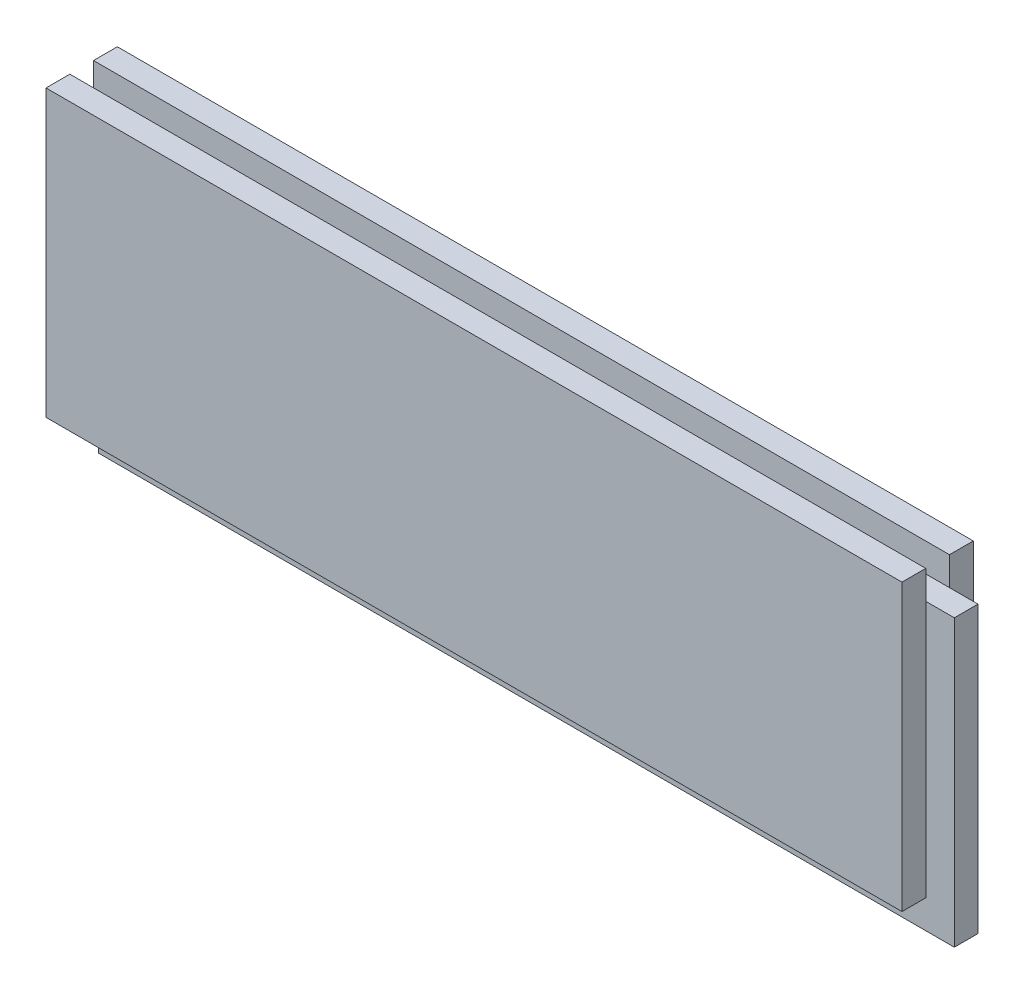
ISO-10303-21;
HEADER;
FILE_DESCRIPTION(('STEP AP214'),'2;1');
FILE_NAME('part.step','',(''),(''),'','','');
FILE_SCHEMA(('AUTOMOTIVE_DESIGN { 1 0 10303 214 1 1 1 1 }'));
ENDSEC;
DATA;
#1=APPLICATION_CONTEXT('core data for automotive mechanical design processes');
#2=APPLICATION_PROTOCOL_DEFINITION('international standard','automotive_design',2000,#1);
#3=PRODUCT_CONTEXT('',#1,'mechanical');
#4=PRODUCT('Part','Part','',(#3));
#5=PRODUCT_RELATED_PRODUCT_CATEGORY('part','',(#4));
#6=PRODUCT_DEFINITION_FORMATION('','',#4);
#7=PRODUCT_DEFINITION_CONTEXT('part definition',#1,'design');
#8=PRODUCT_DEFINITION('design','',#6,#7);
#9=PRODUCT_DEFINITION_SHAPE('','',#8);
#10=(LENGTH_UNIT() NAMED_UNIT(*) SI_UNIT(.MILLI.,.METRE.));
#11=(NAMED_UNIT(*) PLANE_ANGLE_UNIT() SI_UNIT($,.RADIAN.));
#12=(NAMED_UNIT(*) SI_UNIT($,.STERADIAN.) SOLID_ANGLE_UNIT());
#13=UNCERTAINTY_MEASURE_WITH_UNIT(LENGTH_MEASURE(1.E-05),#10,'distance_accuracy_value','');
#14=(GEOMETRIC_REPRESENTATION_CONTEXT(3) GLOBAL_UNCERTAINTY_ASSIGNED_CONTEXT((#13)) GLOBAL_UNIT_ASSIGNED_CONTEXT((#10,
#11,#12)) REPRESENTATION_CONTEXT('',''));
#15=CARTESIAN_POINT('',(0.,0.,0.));
#16=DIRECTION('',(0.,0.,1.));
#17=DIRECTION('',(1.,0.,0.));
#18=AXIS2_PLACEMENT_3D('',#15,#16,#17);
#19=CARTESIAN_POINT('',(30.,-10.,2.5));
#20=DIRECTION('',(-1.,0.,0.));
#21=DIRECTION('',(0.,0.,1.));
#22=AXIS2_PLACEMENT_3D('',#19,#20,#21);
#23=PLANE('',#22);
#24=DIRECTION('',(0.,-1.,0.));
#25=VECTOR('',#24,1.);
#26=CARTESIAN_POINT('',(30.,-12.,0.830000000000011));
#27=LINE('',#26,#25);
#28=CARTESIAN_POINT('',(30.,8.,0.830000000000002));
#29=VERTEX_POINT('',#28);
#30=CARTESIAN_POINT('',(30.,-10.,0.830000000000011));
#31=VERTEX_POINT('',#30);
#32=EDGE_CURVE('E161',#29,#31,#27,.T.);
#33=ORIENTED_EDGE('',*,*,#32,.F.);
#34=DIRECTION('',(0.,1.,0.));
#35=VECTOR('',#34,1.);
#36=CARTESIAN_POINT('',(30.,8.,0.830000000000002));
#37=LINE('',#36,#35);
#38=CARTESIAN_POINT('',(30.,10.,0.830000000000002));
#39=VERTEX_POINT('',#38);
#40=EDGE_CURVE('E225',#29,#39,#37,.T.);
#41=ORIENTED_EDGE('',*,*,#40,.T.);
#42=DIRECTION('',(0.,0.,-1.));
#43=VECTOR('',#42,1.);
#44=CARTESIAN_POINT('',(30.,10.,2.5));
#45=LINE('',#44,#43);
#46=CARTESIAN_POINT('',(30.,10.,2.5));
#47=VERTEX_POINT('',#46);
#48=EDGE_CURVE('E254',#47,#39,#45,.T.);
#49=ORIENTED_EDGE('',*,*,#48,.F.);
#50=DIRECTION('',(0.,1.,0.));
#51=VECTOR('',#50,1.);
#52=CARTESIAN_POINT('',(30.,-10.,2.5));
#53=LINE('',#52,#51);
#54=CARTESIAN_POINT('',(30.,-10.,2.5));
#55=VERTEX_POINT('',#54);
#56=EDGE_CURVE('E235',#55,#47,#53,.T.);
#57=ORIENTED_EDGE('',*,*,#56,.F.);
#58=DIRECTION('',(0.,0.,-1.));
#59=VECTOR('',#58,1.);
#60=CARTESIAN_POINT('',(30.,-10.,2.5));
#61=LINE('',#60,#59);
#62=EDGE_CURVE('E259',#55,#31,#61,.T.);
#63=ORIENTED_EDGE('',*,*,#62,.T.);
#64=EDGE_LOOP('',(#33,#41,#49,#57,#63));
#65=FACE_BOUND('',#64,.T.);
#66=ADVANCED_FACE('F33',(#65),#23,.F.);
#67=DIRECTION('',(0.,1.,0.));
#68=VECTOR('',#67,1.);
#69=CARTESIAN_POINT('',(30.,-12.,-0.83000000000002));
#70=LINE('',#69,#68);
#71=CARTESIAN_POINT('',(30.,-10.,-0.829999999999991));
#72=VERTEX_POINT('',#71);
#73=CARTESIAN_POINT('',(30.,8.,-0.83000000000002));
#74=VERTEX_POINT('',#73);
#75=EDGE_CURVE('E11',#72,#74,#70,.T.);
#76=ORIENTED_EDGE('',*,*,#75,.F.);
#77=CARTESIAN_POINT('',(30.,-10.,-2.5));
#78=VERTEX_POINT('',#77);
#79=EDGE_CURVE('E186',#72,#78,#61,.T.);
#80=ORIENTED_EDGE('',*,*,#79,.T.);
#81=DIRECTION('',(0.,1.,0.));
#82=VECTOR('',#81,1.);
#83=CARTESIAN_POINT('',(30.,-10.,-2.5));
#84=LINE('',#83,#82);
#85=CARTESIAN_POINT('',(30.,10.,-2.5));
#86=VERTEX_POINT('',#85);
#87=EDGE_CURVE('E245',#78,#86,#84,.T.);
#88=ORIENTED_EDGE('',*,*,#87,.T.);
#89=CARTESIAN_POINT('',(30.,10.,-0.83000000000002));
#90=VERTEX_POINT('',#89);
#91=EDGE_CURVE('E253',#90,#86,#45,.T.);
#92=ORIENTED_EDGE('',*,*,#91,.F.);
#93=DIRECTION('',(0.,1.,0.));
#94=VECTOR('',#93,1.);
#95=CARTESIAN_POINT('',(30.,8.,-0.83000000000002));
#96=LINE('',#95,#94);
#97=EDGE_CURVE('E223',#74,#90,#96,.T.);
#98=ORIENTED_EDGE('',*,*,#97,.F.);
#99=EDGE_LOOP('',(#76,#80,#88,#92,#98));
#100=FACE_BOUND('',#99,.T.);
#101=ADVANCED_FACE('F265',(#100),#23,.F.);
#102=CARTESIAN_POINT('',(30.,-10.,2.5));
#103=DIRECTION('',(0.,1.,0.));
#104=DIRECTION('',(-1.,0.,0.));
#105=AXIS2_PLACEMENT_3D('',#102,#103,#104);
#106=PLANE('',#105);
#107=DIRECTION('',(-1.,0.,0.));
#108=VECTOR('',#107,1.);
#109=CARTESIAN_POINT('',(-28.,-10.,0.830000000000011));
#110=LINE('',#109,#108);
#111=CARTESIAN_POINT('',(-28.,-10.,0.830000000000011));
#112=VERTEX_POINT('',#111);
#113=EDGE_CURVE('E49',#31,#112,#110,.T.);
#114=ORIENTED_EDGE('',*,*,#113,.F.);
#115=ORIENTED_EDGE('',*,*,#62,.F.);
#116=DIRECTION('',(1.,0.,0.));
#117=VECTOR('',#116,1.);
#118=CARTESIAN_POINT('',(30.,-10.,2.5));
#119=LINE('',#118,#117);
#120=CARTESIAN_POINT('',(-30.,-10.,2.5));
#121=VERTEX_POINT('',#120);
#122=EDGE_CURVE('E232',#121,#55,#119,.T.);
#123=ORIENTED_EDGE('',*,*,#122,.F.);
#124=DIRECTION('',(0.,0.,-1.));
#125=VECTOR('',#124,1.);
#126=CARTESIAN_POINT('',(-30.,-10.,2.5));
#127=LINE('',#126,#125);
#128=CARTESIAN_POINT('',(-30.,-10.,0.830000000000011));
#129=VERTEX_POINT('',#128);
#130=EDGE_CURVE('E42',#121,#129,#127,.T.);
#131=ORIENTED_EDGE('',*,*,#130,.T.);
#132=DIRECTION('',(-1.,0.,0.));
#133=VECTOR('',#132,1.);
#134=CARTESIAN_POINT('',(-28.,-10.,0.830000000000011));
#135=LINE('',#134,#133);
#136=EDGE_CURVE('E203',#112,#129,#135,.T.);
#137=ORIENTED_EDGE('',*,*,#136,.F.);
#138=EDGE_LOOP('',(#114,#115,#123,#131,#137));
#139=FACE_BOUND('',#138,.T.);
#140=ADVANCED_FACE('F304',(#139),#106,.F.);
#141=DIRECTION('',(1.,0.,0.));
#142=VECTOR('',#141,1.);
#143=CARTESIAN_POINT('',(-28.,-10.,-0.829999999999991));
#144=LINE('',#143,#142);
#145=CARTESIAN_POINT('',(-28.,-10.,-0.829999999999991));
#146=VERTEX_POINT('',#145);
#147=EDGE_CURVE('E182',#146,#72,#144,.T.);
#148=ORIENTED_EDGE('',*,*,#147,.F.);
#149=DIRECTION('',(-1.,0.,0.));
#150=VECTOR('',#149,1.);
#151=CARTESIAN_POINT('',(-28.,-10.,-0.829999999999991));
#152=LINE('',#151,#150);
#153=CARTESIAN_POINT('',(-30.,-10.,-0.829999999999991));
#154=VERTEX_POINT('',#153);
#155=EDGE_CURVE('E202',#146,#154,#152,.T.);
#156=ORIENTED_EDGE('',*,*,#155,.T.);
#157=CARTESIAN_POINT('',(-30.,-10.,-2.5));
#158=VERTEX_POINT('',#157);
#159=EDGE_CURVE('E260',#154,#158,#127,.T.);
#160=ORIENTED_EDGE('',*,*,#159,.T.);
#161=DIRECTION('',(1.,0.,0.));
#162=VECTOR('',#161,1.);
#163=CARTESIAN_POINT('',(30.,-10.,-2.5));
#164=LINE('',#163,#162);
#165=EDGE_CURVE('E242',#158,#78,#164,.T.);
#166=ORIENTED_EDGE('',*,*,#165,.T.);
#167=ORIENTED_EDGE('',*,*,#79,.F.);
#168=EDGE_LOOP('',(#148,#156,#160,#166,#167));
#169=FACE_BOUND('',#168,.T.);
#170=ADVANCED_FACE('F271',(#169),#106,.F.);
#171=CARTESIAN_POINT('',(-30.,-10.,2.5));
#172=DIRECTION('',(1.,0.,0.));
#173=DIRECTION('',(0.,0.,-1.));
#174=AXIS2_PLACEMENT_3D('',#171,#172,#173);
#175=PLANE('',#174);
#176=ORIENTED_EDGE('',*,*,#159,.F.);
#177=DIRECTION('',(0.,1.,0.));
#178=VECTOR('',#177,1.);
#179=CARTESIAN_POINT('',(-30.,8.,-0.829999999999991));
#180=LINE('',#179,#178);
#181=CARTESIAN_POINT('',(-30.,10.,-0.829999999999991));
#182=VERTEX_POINT('',#181);
#183=EDGE_CURVE('E219',#154,#182,#180,.T.);
#184=ORIENTED_EDGE('',*,*,#183,.T.);
#185=DIRECTION('',(0.,0.,-1.));
#186=VECTOR('',#185,1.);
#187=CARTESIAN_POINT('',(-30.,10.,2.5));
#188=LINE('',#187,#186);
#189=CARTESIAN_POINT('',(-30.,10.,-2.5));
#190=VERTEX_POINT('',#189);
#191=EDGE_CURVE('E239',#182,#190,#188,.T.);
#192=ORIENTED_EDGE('',*,*,#191,.T.);
#193=DIRECTION('',(0.,-1.,0.));
#194=VECTOR('',#193,1.);
#195=CARTESIAN_POINT('',(-30.,-10.,-2.5));
#196=LINE('',#195,#194);
#197=EDGE_CURVE('E222',#190,#158,#196,.T.);
#198=ORIENTED_EDGE('',*,*,#197,.T.);
#199=EDGE_LOOP('',(#176,#184,#192,#198));
#200=FACE_BOUND('',#199,.T.);
#201=ADVANCED_FACE('F310',(#200),#175,.F.);
#202=CARTESIAN_POINT('',(0.,8.,0.));
#203=DIRECTION('',(0.,1.,0.));
#204=DIRECTION('',(-1.,0.,0.));
#205=AXIS2_PLACEMENT_3D('',#202,#203,#204);
#206=PLANE('',#205);
#207=DIRECTION('',(-1.,0.,0.));
#208=VECTOR('',#207,1.);
#209=CARTESIAN_POINT('',(-30.,8.,-0.829999999999991));
#210=LINE('',#209,#208);
#211=CARTESIAN_POINT('',(-28.,8.,-0.829999999999991));
#212=VERTEX_POINT('',#211);
#213=EDGE_CURVE('E212',#74,#212,#210,.T.);
#214=ORIENTED_EDGE('',*,*,#213,.T.);
#215=DIRECTION('',(0.,0.,-1.));
#216=VECTOR('',#215,1.);
#217=CARTESIAN_POINT('',(-28.,8.,-0.829999999999991));
#218=LINE('',#217,#216);
#219=CARTESIAN_POINT('',(-28.,8.,0.830000000000009));
#220=VERTEX_POINT('',#219);
#221=EDGE_CURVE('E200',#220,#212,#218,.T.);
#222=ORIENTED_EDGE('',*,*,#221,.F.);
#223=DIRECTION('',(1.,0.,0.));
#224=VECTOR('',#223,1.);
#225=CARTESIAN_POINT('',(-30.,8.,0.830000000000009));
#226=LINE('',#225,#224);
#227=EDGE_CURVE('E209',#220,#29,#226,.T.);
#228=ORIENTED_EDGE('',*,*,#227,.T.);
#229=DIRECTION('',(-1.,0.,0.));
#230=VECTOR('',#229,1.);
#231=CARTESIAN_POINT('',(32.,8.,0.830000000000011));
#232=LINE('',#231,#230);
#233=CARTESIAN_POINT('',(32.,8.,0.830000000000011));
#234=VERTEX_POINT('',#233);
#235=EDGE_CURVE('E168',#234,#29,#232,.T.);
#236=ORIENTED_EDGE('',*,*,#235,.F.);
#237=DIRECTION('',(0.,0.,1.));
#238=VECTOR('',#237,1.);
#239=CARTESIAN_POINT('',(32.,8.,0.830000000000011));
#240=LINE('',#239,#238);
#241=CARTESIAN_POINT('',(32.,8.,-0.83000000000002));
#242=VERTEX_POINT('',#241);
#243=EDGE_CURVE('E159',#242,#234,#240,.T.);
#244=ORIENTED_EDGE('',*,*,#243,.F.);
#245=DIRECTION('',(-1.,0.,0.));
#246=VECTOR('',#245,1.);
#247=CARTESIAN_POINT('',(32.,8.,-0.83000000000002));
#248=LINE('',#247,#246);
#249=EDGE_CURVE('E174',#242,#74,#248,.T.);
#250=ORIENTED_EDGE('',*,*,#249,.T.);
#251=EDGE_LOOP('',(#214,#222,#228,#236,#244,#250));
#252=FACE_BOUND('',#251,.T.);
#253=ADVANCED_FACE('F288',(#252),#206,.T.);
#254=CARTESIAN_POINT('',(30.,10.,2.5));
#255=DIRECTION('',(0.,-1.,0.));
#256=DIRECTION('',(1.,0.,0.));
#257=AXIS2_PLACEMENT_3D('',#254,#255,#256);
#258=PLANE('',#257);
#259=ORIENTED_EDGE('',*,*,#191,.F.);
#260=DIRECTION('',(-1.,0.,0.));
#261=VECTOR('',#260,1.);
#262=CARTESIAN_POINT('',(-30.,10.,-0.829999999999991));
#263=LINE('',#262,#261);
#264=EDGE_CURVE('E213',#90,#182,#263,.T.);
#265=ORIENTED_EDGE('',*,*,#264,.F.);
#266=ORIENTED_EDGE('',*,*,#91,.T.);
#267=DIRECTION('',(-1.,0.,0.));
#268=VECTOR('',#267,1.);
#269=CARTESIAN_POINT('',(30.,10.,-2.5));
#270=LINE('',#269,#268);
#271=EDGE_CURVE('E233',#86,#190,#270,.T.);
#272=ORIENTED_EDGE('',*,*,#271,.T.);
#273=EDGE_LOOP('',(#259,#265,#266,#272));
#274=FACE_BOUND('',#273,.T.);
#275=ADVANCED_FACE('F278',(#274),#258,.F.);
#276=DIRECTION('',(0.,1.,0.));
#277=VECTOR('',#276,1.);
#278=CARTESIAN_POINT('',(-30.,8.,0.830000000000009));
#279=LINE('',#278,#277);
#280=CARTESIAN_POINT('',(-30.,10.,0.830000000000005));
#281=VERTEX_POINT('',#280);
#282=EDGE_CURVE('E216',#129,#281,#279,.T.);
#283=ORIENTED_EDGE('',*,*,#282,.F.);
#284=ORIENTED_EDGE('',*,*,#130,.F.);
#285=DIRECTION('',(0.,-1.,0.));
#286=VECTOR('',#285,1.);
#287=CARTESIAN_POINT('',(-30.,-10.,2.5));
#288=LINE('',#287,#286);
#289=CARTESIAN_POINT('',(-30.,10.,2.5));
#290=VERTEX_POINT('',#289);
#291=EDGE_CURVE('E229',#290,#121,#288,.T.);
#292=ORIENTED_EDGE('',*,*,#291,.F.);
#293=EDGE_CURVE('E250',#290,#281,#188,.T.);
#294=ORIENTED_EDGE('',*,*,#293,.T.);
#295=EDGE_LOOP('',(#283,#284,#292,#294));
#296=FACE_BOUND('',#295,.T.);
#297=ADVANCED_FACE('F35',(#296),#175,.F.);
#298=ORIENTED_EDGE('',*,*,#48,.T.);
#299=DIRECTION('',(1.,0.,0.));
#300=VECTOR('',#299,1.);
#301=CARTESIAN_POINT('',(-30.,10.,0.830000000000009));
#302=LINE('',#301,#300);
#303=EDGE_CURVE('E206',#281,#39,#302,.T.);
#304=ORIENTED_EDGE('',*,*,#303,.F.);
#305=ORIENTED_EDGE('',*,*,#293,.F.);
#306=DIRECTION('',(-1.,0.,0.));
#307=VECTOR('',#306,1.);
#308=CARTESIAN_POINT('',(30.,10.,2.5));
#309=LINE('',#308,#307);
#310=EDGE_CURVE('E237',#47,#290,#309,.T.);
#311=ORIENTED_EDGE('',*,*,#310,.F.);
#312=EDGE_LOOP('',(#298,#304,#305,#311));
#313=FACE_BOUND('',#312,.T.);
#314=ADVANCED_FACE('F297',(#313),#258,.F.);
#315=CARTESIAN_POINT('',(0.,0.,2.5));
#316=DIRECTION('',(0.,0.,1.));
#317=DIRECTION('',(1.,0.,0.));
#318=AXIS2_PLACEMENT_3D('',#315,#316,#317);
#319=PLANE('',#318);
#320=ORIENTED_EDGE('',*,*,#291,.T.);
#321=ORIENTED_EDGE('',*,*,#122,.T.);
#322=ORIENTED_EDGE('',*,*,#56,.T.);
#323=ORIENTED_EDGE('',*,*,#310,.T.);
#324=EDGE_LOOP('',(#320,#321,#322,#323));
#325=FACE_BOUND('',#324,.T.);
#326=ADVANCED_FACE('F301',(#325),#319,.T.);
#327=CARTESIAN_POINT('',(0.,0.,-2.5));
#328=DIRECTION('',(0.,0.,1.));
#329=DIRECTION('',(1.,0.,0.));
#330=AXIS2_PLACEMENT_3D('',#327,#328,#329);
#331=PLANE('',#330);
#332=ORIENTED_EDGE('',*,*,#197,.F.);
#333=ORIENTED_EDGE('',*,*,#271,.F.);
#334=ORIENTED_EDGE('',*,*,#87,.F.);
#335=ORIENTED_EDGE('',*,*,#165,.F.);
#336=EDGE_LOOP('',(#332,#333,#334,#335));
#337=FACE_BOUND('',#336,.T.);
#338=ADVANCED_FACE('F275',(#337),#331,.F.);
#339=CARTESIAN_POINT('',(-30.,8.,-0.829999999999991));
#340=DIRECTION('',(0.,0.,-1.));
#341=DIRECTION('',(-1.,0.,0.));
#342=AXIS2_PLACEMENT_3D('',#339,#340,#341);
#343=PLANE('',#342);
#344=ORIENTED_EDGE('',*,*,#264,.T.);
#345=ORIENTED_EDGE('',*,*,#183,.F.);
#346=ORIENTED_EDGE('',*,*,#155,.F.);
#347=DIRECTION('',(0.,-1.,0.));
#348=VECTOR('',#347,1.);
#349=CARTESIAN_POINT('',(-28.,8.,-0.829999999999991));
#350=LINE('',#349,#348);
#351=EDGE_CURVE('E195',#212,#146,#350,.T.);
#352=ORIENTED_EDGE('',*,*,#351,.F.);
#353=ORIENTED_EDGE('',*,*,#213,.F.);
#354=ORIENTED_EDGE('',*,*,#97,.T.);
#355=EDGE_LOOP('',(#344,#345,#346,#352,#353,#354));
#356=FACE_BOUND('',#355,.T.);
#357=ADVANCED_FACE('F282',(#356),#343,.F.);
#358=CARTESIAN_POINT('',(-30.,8.,0.830000000000009));
#359=DIRECTION('',(0.,0.,1.));
#360=DIRECTION('',(1.,0.,0.));
#361=AXIS2_PLACEMENT_3D('',#358,#359,#360);
#362=PLANE('',#361);
#363=ORIENTED_EDGE('',*,*,#303,.T.);
#364=ORIENTED_EDGE('',*,*,#40,.F.);
#365=ORIENTED_EDGE('',*,*,#227,.F.);
#366=DIRECTION('',(0.,1.,0.));
#367=VECTOR('',#366,1.);
#368=CARTESIAN_POINT('',(-28.,8.,0.830000000000009));
#369=LINE('',#368,#367);
#370=EDGE_CURVE('E57',#112,#220,#369,.T.);
#371=ORIENTED_EDGE('',*,*,#370,.F.);
#372=ORIENTED_EDGE('',*,*,#136,.T.);
#373=ORIENTED_EDGE('',*,*,#282,.T.);
#374=EDGE_LOOP('',(#363,#364,#365,#371,#372,#373));
#375=FACE_BOUND('',#374,.T.);
#376=ADVANCED_FACE('F292',(#375),#362,.F.);
#377=CARTESIAN_POINT('',(-28.,0.,0.));
#378=DIRECTION('',(-1.,0.,0.));
#379=DIRECTION('',(0.,0.,1.));
#380=AXIS2_PLACEMENT_3D('',#377,#378,#379);
#381=PLANE('',#380);
#382=ORIENTED_EDGE('',*,*,#351,.T.);
#383=DIRECTION('',(0.,1.,0.));
#384=VECTOR('',#383,1.);
#385=CARTESIAN_POINT('',(-28.,-12.,-0.829999999999991));
#386=LINE('',#385,#384);
#387=CARTESIAN_POINT('',(-28.,-12.,-0.829999999999991));
#388=VERTEX_POINT('',#387);
#389=EDGE_CURVE('E193',#388,#146,#386,.T.);
#390=ORIENTED_EDGE('',*,*,#389,.F.);
#391=DIRECTION('',(0.,0.,-1.));
#392=VECTOR('',#391,1.);
#393=CARTESIAN_POINT('',(-28.,-12.,0.830000000000011));
#394=LINE('',#393,#392);
#395=CARTESIAN_POINT('',(-28.,-12.,0.830000000000011));
#396=VERTEX_POINT('',#395);
#397=EDGE_CURVE('E175',#396,#388,#394,.T.);
#398=ORIENTED_EDGE('',*,*,#397,.F.);
#399=DIRECTION('',(0.,1.,0.));
#400=VECTOR('',#399,1.);
#401=CARTESIAN_POINT('',(-28.,-12.,0.830000000000011));
#402=LINE('',#401,#400);
#403=EDGE_CURVE('E144',#396,#112,#402,.T.);
#404=ORIENTED_EDGE('',*,*,#403,.T.);
#405=ORIENTED_EDGE('',*,*,#370,.T.);
#406=ORIENTED_EDGE('',*,*,#221,.T.);
#407=EDGE_LOOP('',(#382,#390,#398,#404,#405,#406));
#408=FACE_BOUND('',#407,.T.);
#409=ADVANCED_FACE('F191',(#408),#381,.T.);
#410=CARTESIAN_POINT('',(-28.,-12.,-0.829999999999991));
#411=DIRECTION('',(0.,0.,1.));
#412=DIRECTION('',(1.,0.,0.));
#413=AXIS2_PLACEMENT_3D('',#410,#411,#412);
#414=PLANE('',#413);
#415=ORIENTED_EDGE('',*,*,#147,.T.);
#416=ORIENTED_EDGE('',*,*,#75,.T.);
#417=ORIENTED_EDGE('',*,*,#249,.F.);
#418=DIRECTION('',(0.,1.,0.));
#419=VECTOR('',#418,1.);
#420=CARTESIAN_POINT('',(32.,-12.,-0.83000000000002));
#421=LINE('',#420,#419);
#422=CARTESIAN_POINT('',(32.,-12.,-0.83000000000002));
#423=VERTEX_POINT('',#422);
#424=EDGE_CURVE('E155',#423,#242,#421,.T.);
#425=ORIENTED_EDGE('',*,*,#424,.F.);
#426=DIRECTION('',(1.,0.,0.));
#427=VECTOR('',#426,1.);
#428=CARTESIAN_POINT('',(-28.,-12.,-0.829999999999991));
#429=LINE('',#428,#427);
#430=EDGE_CURVE('E148',#388,#423,#429,.T.);
#431=ORIENTED_EDGE('',*,*,#430,.F.);
#432=ORIENTED_EDGE('',*,*,#389,.T.);
#433=EDGE_LOOP('',(#415,#416,#417,#425,#431,#432));
#434=FACE_BOUND('',#433,.T.);
#435=ADVANCED_FACE('F287',(#434),#414,.F.);
#436=CARTESIAN_POINT('',(-28.,-12.,0.830000000000011));
#437=DIRECTION('',(0.,0.,-1.));
#438=DIRECTION('',(-1.,0.,0.));
#439=AXIS2_PLACEMENT_3D('',#436,#437,#438);
#440=PLANE('',#439);
#441=ORIENTED_EDGE('',*,*,#113,.T.);
#442=ORIENTED_EDGE('',*,*,#403,.F.);
#443=DIRECTION('',(-1.,0.,0.));
#444=VECTOR('',#443,1.);
#445=CARTESIAN_POINT('',(-28.,-12.,0.830000000000011));
#446=LINE('',#445,#444);
#447=CARTESIAN_POINT('',(32.,-12.,0.830000000000011));
#448=VERTEX_POINT('',#447);
#449=EDGE_CURVE('E138',#448,#396,#446,.T.);
#450=ORIENTED_EDGE('',*,*,#449,.F.);
#451=DIRECTION('',(0.,-1.,0.));
#452=VECTOR('',#451,1.);
#453=CARTESIAN_POINT('',(32.,-12.,0.830000000000011));
#454=LINE('',#453,#452);
#455=EDGE_CURVE('E143',#234,#448,#454,.T.);
#456=ORIENTED_EDGE('',*,*,#455,.F.);
#457=ORIENTED_EDGE('',*,*,#235,.T.);
#458=ORIENTED_EDGE('',*,*,#32,.T.);
#459=EDGE_LOOP('',(#441,#442,#450,#456,#457,#458));
#460=FACE_BOUND('',#459,.T.);
#461=ADVANCED_FACE('F140',(#460),#440,.F.);
#462=CARTESIAN_POINT('',(0.,-12.,0.));
#463=DIRECTION('',(0.,-1.,0.));
#464=DIRECTION('',(1.,0.,0.));
#465=AXIS2_PLACEMENT_3D('',#462,#463,#464);
#466=PLANE('',#465);
#467=ORIENTED_EDGE('',*,*,#397,.T.);
#468=ORIENTED_EDGE('',*,*,#430,.T.);
#469=DIRECTION('',(0.,0.,-1.));
#470=VECTOR('',#469,1.);
#471=CARTESIAN_POINT('',(32.,-12.,0.830000000000011));
#472=LINE('',#471,#470);
#473=EDGE_CURVE('E151',#448,#423,#472,.T.);
#474=ORIENTED_EDGE('',*,*,#473,.F.);
#475=ORIENTED_EDGE('',*,*,#449,.T.);
#476=EDGE_LOOP('',(#467,#468,#474,#475));
#477=FACE_BOUND('',#476,.T.);
#478=ADVANCED_FACE('F152',(#477),#466,.T.);
#479=CARTESIAN_POINT('',(32.,0.,0.));
#480=DIRECTION('',(-1.,0.,0.));
#481=DIRECTION('',(0.,0.,1.));
#482=AXIS2_PLACEMENT_3D('',#479,#480,#481);
#483=PLANE('',#482);
#484=ORIENTED_EDGE('',*,*,#455,.T.);
#485=ORIENTED_EDGE('',*,*,#473,.T.);
#486=ORIENTED_EDGE('',*,*,#424,.T.);
#487=ORIENTED_EDGE('',*,*,#243,.T.);
#488=EDGE_LOOP('',(#484,#485,#486,#487));
#489=FACE_BOUND('',#488,.T.);
#490=ADVANCED_FACE('F157',(#489),#483,.F.);
#491=CLOSED_SHELL('',(#66,#101,#140,#170,#201,#253,#275,#297,#314,#326,#338,#357,#376,#409,#435,
#461,#478,#490));
#492=MANIFOLD_SOLID_BREP('B2',#491);
#493=ADVANCED_BREP_SHAPE_REPRESENTATION('',(#18,#492),#14);
#494=SHAPE_DEFINITION_REPRESENTATION(#9,#493);
ENDSEC;
END-ISO-10303-21;
